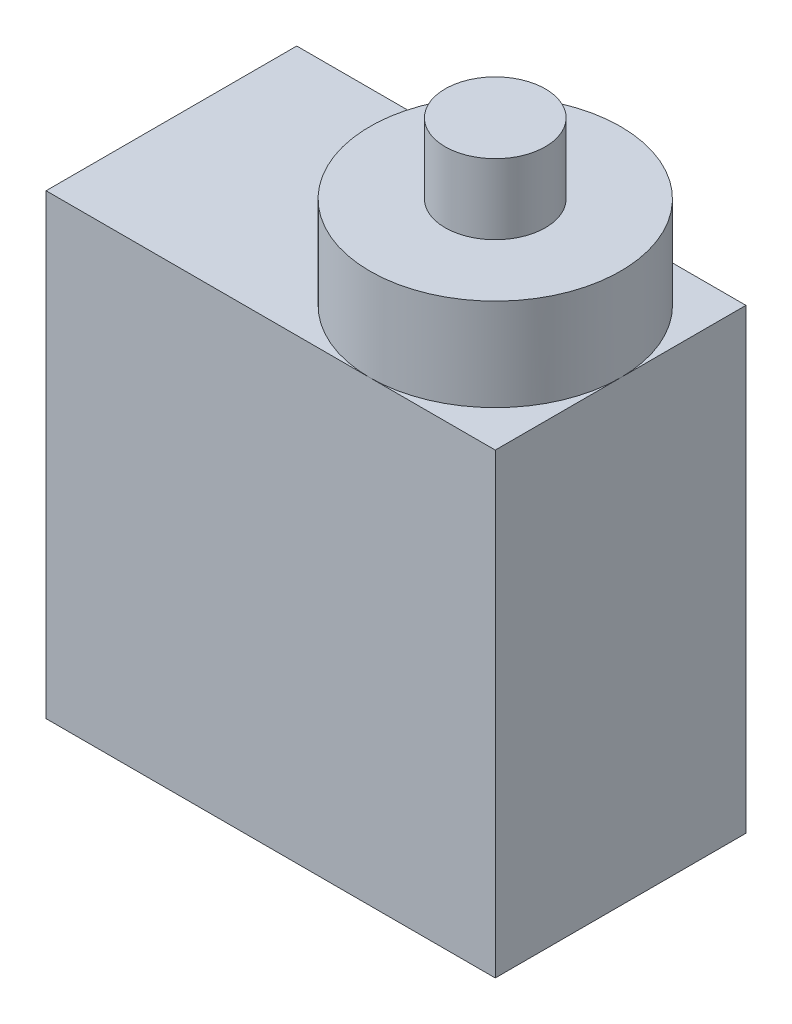
ISO-10303-21;
HEADER;
FILE_DESCRIPTION(('STEP AP214'),'2;1');
FILE_NAME('part.step','',(''),(''),'','','');
FILE_SCHEMA(('AUTOMOTIVE_DESIGN { 1 0 10303 214 1 1 1 1 }'));
ENDSEC;
DATA;
#1=APPLICATION_CONTEXT('core data for automotive mechanical design processes');
#2=APPLICATION_PROTOCOL_DEFINITION('international standard','automotive_design',2000,#1);
#3=PRODUCT_CONTEXT('',#1,'mechanical');
#4=PRODUCT('Part','Part','',(#3));
#5=PRODUCT_RELATED_PRODUCT_CATEGORY('part','',(#4));
#6=PRODUCT_DEFINITION_FORMATION('','',#4);
#7=PRODUCT_DEFINITION_CONTEXT('part definition',#1,'design');
#8=PRODUCT_DEFINITION('design','',#6,#7);
#9=PRODUCT_DEFINITION_SHAPE('','',#8);
#10=(LENGTH_UNIT() NAMED_UNIT(*) SI_UNIT(.MILLI.,.METRE.));
#11=(NAMED_UNIT(*) PLANE_ANGLE_UNIT() SI_UNIT($,.RADIAN.));
#12=(NAMED_UNIT(*) SI_UNIT($,.STERADIAN.) SOLID_ANGLE_UNIT());
#13=UNCERTAINTY_MEASURE_WITH_UNIT(LENGTH_MEASURE(1.E-05),#10,'distance_accuracy_value','');
#14=(GEOMETRIC_REPRESENTATION_CONTEXT(3) GLOBAL_UNCERTAINTY_ASSIGNED_CONTEXT((#13)) GLOBAL_UNIT_ASSIGNED_CONTEXT((#10,
#11,#12)) REPRESENTATION_CONTEXT('',''));
#15=CARTESIAN_POINT('',(0.,0.,0.));
#16=DIRECTION('',(0.,0.,1.));
#17=DIRECTION('',(1.,0.,0.));
#18=AXIS2_PLACEMENT_3D('',#15,#16,#17);
#19=CARTESIAN_POINT('',(0.,11.4,0.));
#20=DIRECTION('',(0.,1.,0.));
#21=DIRECTION('',(0.,0.,1.));
#22=AXIS2_PLACEMENT_3D('',#19,#20,#21);
#23=PLANE('',#22);
#24=CARTESIAN_POINT('',(4.95,11.4,0.));
#25=DIRECTION('',(0.,1.,0.));
#26=DIRECTION('',(0.,0.,1.));
#27=AXIS2_PLACEMENT_3D('',#24,#25,#26);
#28=CIRCLE('',#27,6.25);
#29=CARTESIAN_POINT('',(4.95,11.4,6.25));
#30=VERTEX_POINT('',#29);
#31=CARTESIAN_POINT('',(11.2,11.4,0.));
#32=VERTEX_POINT('',#31);
#33=EDGE_CURVE('E118',#30,#32,#28,.T.);
#34=ORIENTED_EDGE('',*,*,#33,.F.);
#35=DIRECTION('',(1.,0.,0.));
#36=VECTOR('',#35,1.);
#37=CARTESIAN_POINT('',(-11.2,11.4,6.25));
#38=LINE('',#37,#36);
#39=CARTESIAN_POINT('',(11.2,11.4,6.25));
#40=VERTEX_POINT('',#39);
#41=EDGE_CURVE('E106',#30,#40,#38,.T.);
#42=ORIENTED_EDGE('',*,*,#41,.T.);
#43=DIRECTION('',(0.,0.,1.));
#44=VECTOR('',#43,1.);
#45=CARTESIAN_POINT('',(11.2,11.4,-6.25));
#46=LINE('',#45,#44);
#47=EDGE_CURVE('E105',#32,#40,#46,.T.);
#48=ORIENTED_EDGE('',*,*,#47,.F.);
#49=EDGE_LOOP('',(#34,#42,#48));
#50=FACE_BOUND('',#49,.T.);
#51=ADVANCED_FACE('F45',(#50),#23,.T.);
#52=CARTESIAN_POINT('',(4.95,11.4,-6.25));
#53=VERTEX_POINT('',#52);
#54=EDGE_CURVE('E55',#32,#53,#28,.T.);
#55=ORIENTED_EDGE('',*,*,#54,.F.);
#56=CARTESIAN_POINT('',(11.2,11.4,-6.25));
#57=VERTEX_POINT('',#56);
#58=EDGE_CURVE('E136',#57,#32,#46,.T.);
#59=ORIENTED_EDGE('',*,*,#58,.F.);
#60=DIRECTION('',(1.,0.,0.));
#61=VECTOR('',#60,1.);
#62=CARTESIAN_POINT('',(-11.2,11.4,-6.25));
#63=LINE('',#62,#61);
#64=EDGE_CURVE('E139',#53,#57,#63,.T.);
#65=ORIENTED_EDGE('',*,*,#64,.F.);
#66=EDGE_LOOP('',(#55,#59,#65));
#67=FACE_BOUND('',#66,.T.);
#68=ADVANCED_FACE('F200',(#67),#23,.T.);
#69=CARTESIAN_POINT('',(-11.2,-11.4,-6.25));
#70=DIRECTION('',(-1.,0.,0.));
#71=DIRECTION('',(0.,0.,1.));
#72=AXIS2_PLACEMENT_3D('',#69,#70,#71);
#73=PLANE('',#72);
#74=DIRECTION('',(0.,1.,0.));
#75=VECTOR('',#74,1.);
#76=CARTESIAN_POINT('',(-11.2,-11.4,6.25));
#77=LINE('',#76,#75);
#78=CARTESIAN_POINT('',(-11.2,-11.4,6.25));
#79=VERTEX_POINT('',#78);
#80=CARTESIAN_POINT('',(-11.2,11.4,6.25));
#81=VERTEX_POINT('',#80);
#82=EDGE_CURVE('E49',#79,#81,#77,.T.);
#83=ORIENTED_EDGE('',*,*,#82,.T.);
#84=DIRECTION('',(0.,0.,1.));
#85=VECTOR('',#84,1.);
#86=CARTESIAN_POINT('',(-11.2,11.4,-6.25));
#87=LINE('',#86,#85);
#88=CARTESIAN_POINT('',(-11.2,11.4,-6.25));
#89=VERTEX_POINT('',#88);
#90=EDGE_CURVE('E102',#89,#81,#87,.T.);
#91=ORIENTED_EDGE('',*,*,#90,.F.);
#92=DIRECTION('',(0.,1.,0.));
#93=VECTOR('',#92,1.);
#94=CARTESIAN_POINT('',(-11.2,-11.4,-6.25));
#95=LINE('',#94,#93);
#96=CARTESIAN_POINT('',(-11.2,-11.4,-6.25));
#97=VERTEX_POINT('',#96);
#98=EDGE_CURVE('E127',#97,#89,#95,.T.);
#99=ORIENTED_EDGE('',*,*,#98,.F.);
#100=DIRECTION('',(0.,0.,1.));
#101=VECTOR('',#100,1.);
#102=CARTESIAN_POINT('',(-11.2,-11.4,-6.25));
#103=LINE('',#102,#101);
#104=EDGE_CURVE('E144',#97,#79,#103,.T.);
#105=ORIENTED_EDGE('',*,*,#104,.T.);
#106=EDGE_LOOP('',(#83,#91,#99,#105));
#107=FACE_BOUND('',#106,.T.);
#108=ADVANCED_FACE('F47',(#107),#73,.T.);
#109=CARTESIAN_POINT('',(-11.2,-11.4,-6.25));
#110=DIRECTION('',(0.,0.,1.));
#111=DIRECTION('',(1.,0.,0.));
#112=AXIS2_PLACEMENT_3D('',#109,#110,#111);
#113=PLANE('',#112);
#114=ORIENTED_EDGE('',*,*,#98,.T.);
#115=EDGE_CURVE('E140',#89,#53,#63,.T.);
#116=ORIENTED_EDGE('',*,*,#115,.T.);
#117=ORIENTED_EDGE('',*,*,#64,.T.);
#118=DIRECTION('',(0.,1.,0.));
#119=VECTOR('',#118,1.);
#120=CARTESIAN_POINT('',(11.2,-11.4,-6.25));
#121=LINE('',#120,#119);
#122=CARTESIAN_POINT('',(11.2,-11.4,-6.25));
#123=VERTEX_POINT('',#122);
#124=EDGE_CURVE('E130',#123,#57,#121,.T.);
#125=ORIENTED_EDGE('',*,*,#124,.F.);
#126=DIRECTION('',(1.,0.,0.));
#127=VECTOR('',#126,1.);
#128=CARTESIAN_POINT('',(-11.2,-11.4,-6.25));
#129=LINE('',#128,#127);
#130=EDGE_CURVE('E154',#97,#123,#129,.T.);
#131=ORIENTED_EDGE('',*,*,#130,.F.);
#132=EDGE_LOOP('',(#114,#116,#117,#125,#131));
#133=FACE_BOUND('',#132,.T.);
#134=ADVANCED_FACE('F208',(#133),#113,.F.);
#135=CARTESIAN_POINT('',(11.2,-11.4,-6.25));
#136=DIRECTION('',(-1.,0.,0.));
#137=DIRECTION('',(0.,0.,1.));
#138=AXIS2_PLACEMENT_3D('',#135,#136,#137);
#139=PLANE('',#138);
#140=ORIENTED_EDGE('',*,*,#124,.T.);
#141=ORIENTED_EDGE('',*,*,#58,.T.);
#142=ORIENTED_EDGE('',*,*,#47,.T.);
#143=DIRECTION('',(0.,1.,0.));
#144=VECTOR('',#143,1.);
#145=CARTESIAN_POINT('',(11.2,-11.4,6.25));
#146=LINE('',#145,#144);
#147=CARTESIAN_POINT('',(11.2,-11.4,6.25));
#148=VERTEX_POINT('',#147);
#149=EDGE_CURVE('E114',#148,#40,#146,.T.);
#150=ORIENTED_EDGE('',*,*,#149,.F.);
#151=DIRECTION('',(0.,0.,1.));
#152=VECTOR('',#151,1.);
#153=CARTESIAN_POINT('',(11.2,-11.4,-6.25));
#154=LINE('',#153,#152);
#155=EDGE_CURVE('E151',#123,#148,#154,.T.);
#156=ORIENTED_EDGE('',*,*,#155,.F.);
#157=EDGE_LOOP('',(#140,#141,#142,#150,#156));
#158=FACE_BOUND('',#157,.T.);
#159=ADVANCED_FACE('F170',(#158),#139,.F.);
#160=CARTESIAN_POINT('',(-11.2,-11.4,6.25));
#161=DIRECTION('',(0.,0.,1.));
#162=DIRECTION('',(1.,0.,0.));
#163=AXIS2_PLACEMENT_3D('',#160,#161,#162);
#164=PLANE('',#163);
#165=ORIENTED_EDGE('',*,*,#149,.T.);
#166=ORIENTED_EDGE('',*,*,#41,.F.);
#167=EDGE_CURVE('E98',#81,#30,#38,.T.);
#168=ORIENTED_EDGE('',*,*,#167,.F.);
#169=ORIENTED_EDGE('',*,*,#82,.F.);
#170=DIRECTION('',(1.,0.,0.));
#171=VECTOR('',#170,1.);
#172=CARTESIAN_POINT('',(-11.2,-11.4,6.25));
#173=LINE('',#172,#171);
#174=EDGE_CURVE('E148',#79,#148,#173,.T.);
#175=ORIENTED_EDGE('',*,*,#174,.T.);
#176=EDGE_LOOP('',(#165,#166,#168,#169,#175));
#177=FACE_BOUND('',#176,.T.);
#178=ADVANCED_FACE('F111',(#177),#164,.T.);
#179=CARTESIAN_POINT('',(0.,-11.4,0.));
#180=DIRECTION('',(0.,1.,0.));
#181=DIRECTION('',(0.,0.,1.));
#182=AXIS2_PLACEMENT_3D('',#179,#180,#181);
#183=PLANE('',#182);
#184=ORIENTED_EDGE('',*,*,#104,.F.);
#185=ORIENTED_EDGE('',*,*,#130,.T.);
#186=ORIENTED_EDGE('',*,*,#155,.T.);
#187=ORIENTED_EDGE('',*,*,#174,.F.);
#188=EDGE_LOOP('',(#184,#185,#186,#187));
#189=FACE_BOUND('',#188,.T.);
#190=ADVANCED_FACE('F165',(#189),#183,.F.);
#191=EDGE_CURVE('E63',#53,#30,#28,.T.);
#192=ORIENTED_EDGE('',*,*,#191,.F.);
#193=ORIENTED_EDGE('',*,*,#115,.F.);
#194=ORIENTED_EDGE('',*,*,#90,.T.);
#195=ORIENTED_EDGE('',*,*,#167,.T.);
#196=EDGE_LOOP('',(#192,#193,#194,#195));
#197=FACE_BOUND('',#196,.T.);
#198=ADVANCED_FACE('F100',(#197),#23,.T.);
#199=CARTESIAN_POINT('',(4.95,16.,0.));
#200=DIRECTION('',(0.,-1.,0.));
#201=DIRECTION('',(0.,0.,-1.));
#202=AXIS2_PLACEMENT_3D('',#199,#200,#201);
#203=CYLINDRICAL_SURFACE('',#202,6.25);
#204=CARTESIAN_POINT('',(4.95,16.,0.));
#205=DIRECTION('',(0.,1.,0.));
#206=DIRECTION('',(0.,0.,1.));
#207=AXIS2_PLACEMENT_3D('',#204,#205,#206);
#208=CIRCLE('',#207,6.25);
#209=CARTESIAN_POINT('',(4.95,16.,6.25));
#210=VERTEX_POINT('',#209);
#211=EDGE_CURVE('E122',#210,#210,#208,.T.);
#212=ORIENTED_EDGE('',*,*,#211,.F.);
#213=EDGE_LOOP('',(#212));
#214=FACE_BOUND('',#213,.T.);
#215=ORIENTED_EDGE('',*,*,#33,.T.);
#216=ORIENTED_EDGE('',*,*,#54,.T.);
#217=ORIENTED_EDGE('',*,*,#191,.T.);
#218=EDGE_LOOP('',(#215,#216,#217));
#219=FACE_BOUND('',#218,.T.);
#220=ADVANCED_FACE('F125',(#214,#219),#203,.T.);
#221=CARTESIAN_POINT('',(4.95,16.,0.));
#222=DIRECTION('',(0.,1.,0.));
#223=DIRECTION('',(0.,0.,1.));
#224=AXIS2_PLACEMENT_3D('',#221,#222,#223);
#225=PLANE('',#224);
#226=CARTESIAN_POINT('',(4.95,16.,0.));
#227=DIRECTION('',(0.,1.,0.));
#228=DIRECTION('',(0.,0.,1.));
#229=AXIS2_PLACEMENT_3D('',#226,#227,#228);
#230=CIRCLE('',#229,2.5);
#231=CARTESIAN_POINT('',(4.95,16.,2.5));
#232=VERTEX_POINT('',#231);
#233=EDGE_CURVE('E11',#232,#232,#230,.T.);
#234=ORIENTED_EDGE('',*,*,#233,.F.);
#235=EDGE_LOOP('',(#234));
#236=FACE_BOUND('',#235,.T.);
#237=ORIENTED_EDGE('',*,*,#211,.T.);
#238=EDGE_LOOP('',(#237));
#239=FACE_BOUND('',#238,.T.);
#240=ADVANCED_FACE('F185',(#236,#239),#225,.T.);
#241=CARTESIAN_POINT('',(4.95,19.5,0.));
#242=DIRECTION('',(0.,-1.,0.));
#243=DIRECTION('',(0.,0.,-1.));
#244=AXIS2_PLACEMENT_3D('',#241,#242,#243);
#245=CYLINDRICAL_SURFACE('',#244,2.5);
#246=CARTESIAN_POINT('',(4.95,19.5,0.));
#247=DIRECTION('',(0.,1.,0.));
#248=DIRECTION('',(0.,0.,1.));
#249=AXIS2_PLACEMENT_3D('',#246,#247,#248);
#250=CIRCLE('',#249,2.5);
#251=CARTESIAN_POINT('',(4.95,19.5,2.5));
#252=VERTEX_POINT('',#251);
#253=EDGE_CURVE('E123',#252,#252,#250,.T.);
#254=ORIENTED_EDGE('',*,*,#253,.F.);
#255=EDGE_LOOP('',(#254));
#256=FACE_BOUND('',#255,.T.);
#257=ORIENTED_EDGE('',*,*,#233,.T.);
#258=EDGE_LOOP('',(#257));
#259=FACE_BOUND('',#258,.T.);
#260=ADVANCED_FACE('F182',(#256,#259),#245,.T.);
#261=CARTESIAN_POINT('',(4.95,19.5,0.));
#262=DIRECTION('',(0.,1.,0.));
#263=DIRECTION('',(0.,0.,1.));
#264=AXIS2_PLACEMENT_3D('',#261,#262,#263);
#265=PLANE('',#264);
#266=ORIENTED_EDGE('',*,*,#253,.T.);
#267=EDGE_LOOP('',(#266));
#268=FACE_BOUND('',#267,.T.);
#269=ADVANCED_FACE('F180',(#268),#265,.T.);
#270=CLOSED_SHELL('',(#51,#68,#108,#134,#159,#178,#190,#198,#220,#240,#260,#269));
#271=MANIFOLD_SOLID_BREP('B2',#270);
#272=ADVANCED_BREP_SHAPE_REPRESENTATION('',(#18,#271),#14);
#273=SHAPE_DEFINITION_REPRESENTATION(#9,#272);
ENDSEC;
END-ISO-10303-21;
